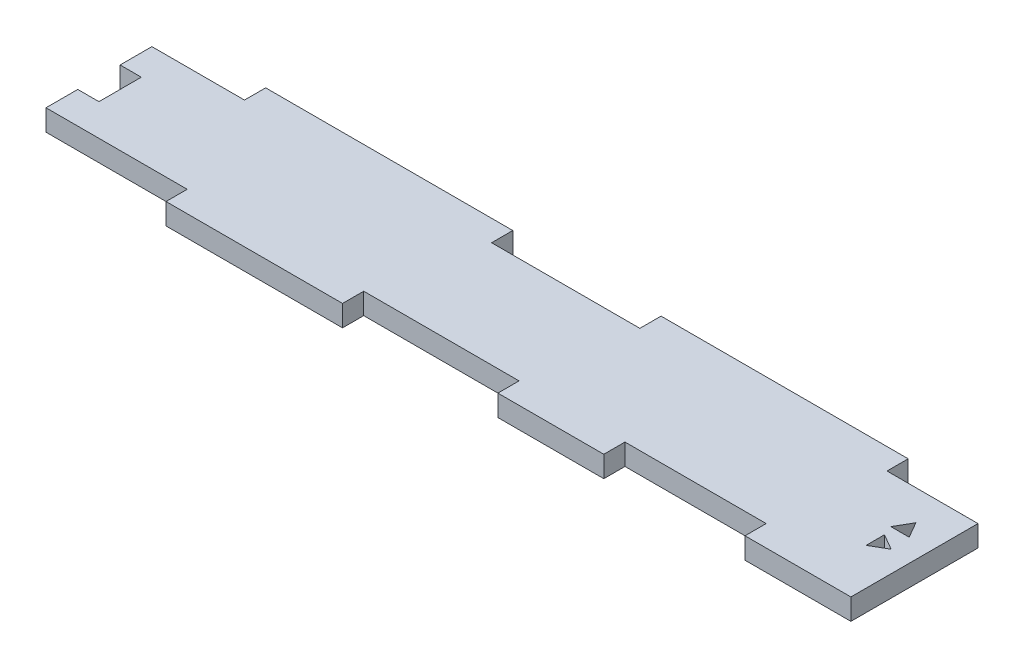
ISO-10303-21;
HEADER;
FILE_DESCRIPTION(('STEP AP214'),'2;1');
FILE_NAME('part.step','',(''),(''),'','','');
FILE_SCHEMA(('AUTOMOTIVE_DESIGN { 1 0 10303 214 1 1 1 1 }'));
ENDSEC;
DATA;
#1=APPLICATION_CONTEXT('core data for automotive mechanical design processes');
#2=APPLICATION_PROTOCOL_DEFINITION('international standard','automotive_design',2000,#1);
#3=PRODUCT_CONTEXT('',#1,'mechanical');
#4=PRODUCT('Part','Part','',(#3));
#5=PRODUCT_RELATED_PRODUCT_CATEGORY('part','',(#4));
#6=PRODUCT_DEFINITION_FORMATION('','',#4);
#7=PRODUCT_DEFINITION_CONTEXT('part definition',#1,'design');
#8=PRODUCT_DEFINITION('design','',#6,#7);
#9=PRODUCT_DEFINITION_SHAPE('','',#8);
#10=(LENGTH_UNIT() NAMED_UNIT(*) SI_UNIT(.MILLI.,.METRE.));
#11=(NAMED_UNIT(*) PLANE_ANGLE_UNIT() SI_UNIT($,.RADIAN.));
#12=(NAMED_UNIT(*) SI_UNIT($,.STERADIAN.) SOLID_ANGLE_UNIT());
#13=UNCERTAINTY_MEASURE_WITH_UNIT(LENGTH_MEASURE(1.E-05),#10,'distance_accuracy_value','');
#14=(GEOMETRIC_REPRESENTATION_CONTEXT(3) GLOBAL_UNCERTAINTY_ASSIGNED_CONTEXT((#13)) GLOBAL_UNIT_ASSIGNED_CONTEXT((#10,
#11,#12)) REPRESENTATION_CONTEXT('',''));
#15=CARTESIAN_POINT('',(0.,0.,0.));
#16=DIRECTION('',(0.,0.,1.));
#17=DIRECTION('',(1.,0.,0.));
#18=AXIS2_PLACEMENT_3D('',#15,#16,#17);
#19=CARTESIAN_POINT('',(-58.5,1.5,-7.5));
#20=DIRECTION('',(1.,0.,0.));
#21=DIRECTION('',(0.,0.,-1.));
#22=AXIS2_PLACEMENT_3D('',#19,#20,#21);
#23=PLANE('',#22);
#24=DIRECTION('',(0.,0.,1.));
#25=VECTOR('',#24,1.);
#26=CARTESIAN_POINT('',(-58.5,-1.5,-7.5));
#27=LINE('',#26,#25);
#28=CARTESIAN_POINT('',(-58.5,-1.5,-7.5));
#29=VERTEX_POINT('',#28);
#30=CARTESIAN_POINT('',(-58.5,-1.5,-3.));
#31=VERTEX_POINT('',#30);
#32=EDGE_CURVE('E308',#29,#31,#27,.T.);
#33=ORIENTED_EDGE('',*,*,#32,.T.);
#34=DIRECTION('',(0.,1.,0.));
#35=VECTOR('',#34,1.);
#36=CARTESIAN_POINT('',(-58.5,-1.5,-3.));
#37=LINE('',#36,#35);
#38=CARTESIAN_POINT('',(-58.5,1.5,-3.));
#39=VERTEX_POINT('',#38);
#40=EDGE_CURVE('E567',#31,#39,#37,.T.);
#41=ORIENTED_EDGE('',*,*,#40,.T.);
#42=DIRECTION('',(0.,0.,1.));
#43=VECTOR('',#42,1.);
#44=CARTESIAN_POINT('',(-58.5,1.5,-7.5));
#45=LINE('',#44,#43);
#46=CARTESIAN_POINT('',(-58.5,1.5,-7.5));
#47=VERTEX_POINT('',#46);
#48=EDGE_CURVE('E280',#47,#39,#45,.T.);
#49=ORIENTED_EDGE('',*,*,#48,.F.);
#50=DIRECTION('',(0.,-1.,0.));
#51=VECTOR('',#50,1.);
#52=CARTESIAN_POINT('',(-58.5,1.5,-7.5));
#53=LINE('',#52,#51);
#54=EDGE_CURVE('E306',#47,#29,#53,.T.);
#55=ORIENTED_EDGE('',*,*,#54,.T.);
#56=EDGE_LOOP('',(#33,#41,#49,#55));
#57=FACE_BOUND('',#56,.T.);
#58=ADVANCED_FACE('F43',(#57),#23,.F.);
#59=CARTESIAN_POINT('',(-58.5,1.5,-7.5));
#60=DIRECTION('',(0.,0.,1.));
#61=DIRECTION('',(1.,0.,0.));
#62=AXIS2_PLACEMENT_3D('',#59,#60,#61);
#63=PLANE('',#62);
#64=DIRECTION('',(0.,-1.,0.));
#65=VECTOR('',#64,1.);
#66=CARTESIAN_POINT('',(10.61,1.5,-7.49999999999999));
#67=LINE('',#66,#65);
#68=CARTESIAN_POINT('',(10.61,1.5,-7.5));
#69=VERTEX_POINT('',#68);
#70=CARTESIAN_POINT('',(10.61,-1.5,-7.49999999999999));
#71=VERTEX_POINT('',#70);
#72=EDGE_CURVE('E366',#69,#71,#67,.T.);
#73=ORIENTED_EDGE('',*,*,#72,.T.);
#74=DIRECTION('',(-1.,0.,0.));
#75=VECTOR('',#74,1.);
#76=CARTESIAN_POINT('',(-58.5,-1.5,-7.5));
#77=LINE('',#76,#75);
#78=CARTESIAN_POINT('',(-10.39,-1.5,-7.49999999999999));
#79=VERTEX_POINT('',#78);
#80=EDGE_CURVE('E287',#71,#79,#77,.T.);
#81=ORIENTED_EDGE('',*,*,#80,.T.);
#82=DIRECTION('',(0.,-1.,0.));
#83=VECTOR('',#82,1.);
#84=CARTESIAN_POINT('',(-10.39,1.5,-7.49999999999999));
#85=LINE('',#84,#83);
#86=CARTESIAN_POINT('',(-10.39,1.5,-7.49999999999999));
#87=VERTEX_POINT('',#86);
#88=EDGE_CURVE('E396',#87,#79,#85,.T.);
#89=ORIENTED_EDGE('',*,*,#88,.F.);
#90=DIRECTION('',(-1.,0.,0.));
#91=VECTOR('',#90,1.);
#92=CARTESIAN_POINT('',(-58.5,1.5,-7.5));
#93=LINE('',#92,#91);
#94=EDGE_CURVE('E307',#69,#87,#93,.T.);
#95=ORIENTED_EDGE('',*,*,#94,.F.);
#96=EDGE_LOOP('',(#73,#81,#89,#95));
#97=FACE_BOUND('',#96,.T.);
#98=ADVANCED_FACE('F554',(#97),#63,.F.);
#99=DIRECTION('',(0.,-1.,0.));
#100=VECTOR('',#99,1.);
#101=CARTESIAN_POINT('',(45.61,1.5,-7.49999999999999));
#102=LINE('',#101,#100);
#103=CARTESIAN_POINT('',(45.61,1.5,-7.49999999999999));
#104=VERTEX_POINT('',#103);
#105=CARTESIAN_POINT('',(45.61,-1.5,-7.49999999999999));
#106=VERTEX_POINT('',#105);
#107=EDGE_CURVE('E363',#104,#106,#102,.T.);
#108=ORIENTED_EDGE('',*,*,#107,.F.);
#109=CARTESIAN_POINT('',(58.5,1.5,-7.49999999999999));
#110=VERTEX_POINT('',#109);
#111=EDGE_CURVE('E302',#110,#104,#93,.T.);
#112=ORIENTED_EDGE('',*,*,#111,.F.);
#113=DIRECTION('',(0.,-1.,0.));
#114=VECTOR('',#113,1.);
#115=CARTESIAN_POINT('',(58.5,1.5,-7.49999999999999));
#116=LINE('',#115,#114);
#117=CARTESIAN_POINT('',(58.5,-1.5,-7.49999999999999));
#118=VERTEX_POINT('',#117);
#119=EDGE_CURVE('E52',#110,#118,#116,.T.);
#120=ORIENTED_EDGE('',*,*,#119,.T.);
#121=EDGE_CURVE('E281',#118,#106,#77,.T.);
#122=ORIENTED_EDGE('',*,*,#121,.T.);
#123=EDGE_LOOP('',(#108,#112,#120,#122));
#124=FACE_BOUND('',#123,.T.);
#125=ADVANCED_FACE('F329',(#124),#63,.F.);
#126=CARTESIAN_POINT('',(-58.5,1.5,7.5));
#127=DIRECTION('',(0.,0.,-1.));
#128=DIRECTION('',(-1.,0.,0.));
#129=AXIS2_PLACEMENT_3D('',#126,#127,#128);
#130=PLANE('',#129);
#131=DIRECTION('',(0.,-1.,0.));
#132=VECTOR('',#131,1.);
#133=CARTESIAN_POINT('',(-38.5,1.5,7.5));
#134=LINE('',#133,#132);
#135=CARTESIAN_POINT('',(-38.5,1.5,7.5));
#136=VERTEX_POINT('',#135);
#137=CARTESIAN_POINT('',(-38.5,-1.5,7.5));
#138=VERTEX_POINT('',#137);
#139=EDGE_CURVE('E417',#136,#138,#134,.T.);
#140=ORIENTED_EDGE('',*,*,#139,.F.);
#141=DIRECTION('',(1.,0.,0.));
#142=VECTOR('',#141,1.);
#143=CARTESIAN_POINT('',(-58.5,1.5,7.5));
#144=LINE('',#143,#142);
#145=CARTESIAN_POINT('',(-58.5,1.5,7.5));
#146=VERTEX_POINT('',#145);
#147=EDGE_CURVE('E294',#146,#136,#144,.T.);
#148=ORIENTED_EDGE('',*,*,#147,.F.);
#149=DIRECTION('',(0.,-1.,0.));
#150=VECTOR('',#149,1.);
#151=CARTESIAN_POINT('',(-58.5,1.5,7.5));
#152=LINE('',#151,#150);
#153=CARTESIAN_POINT('',(-58.5,-1.5,7.5));
#154=VERTEX_POINT('',#153);
#155=EDGE_CURVE('E11',#146,#154,#152,.T.);
#156=ORIENTED_EDGE('',*,*,#155,.T.);
#157=DIRECTION('',(1.,0.,0.));
#158=VECTOR('',#157,1.);
#159=CARTESIAN_POINT('',(-58.5,-1.5,7.5));
#160=LINE('',#159,#158);
#161=EDGE_CURVE('E314',#154,#138,#160,.T.);
#162=ORIENTED_EDGE('',*,*,#161,.T.);
#163=EDGE_LOOP('',(#140,#148,#156,#162));
#164=FACE_BOUND('',#163,.T.);
#165=ADVANCED_FACE('F511',(#164),#130,.F.);
#166=DIRECTION('',(0.,-1.,0.));
#167=VECTOR('',#166,1.);
#168=CARTESIAN_POINT('',(-13.5,1.5,7.5));
#169=LINE('',#168,#167);
#170=CARTESIAN_POINT('',(-13.5,1.5,7.5));
#171=VERTEX_POINT('',#170);
#172=CARTESIAN_POINT('',(-13.5,-1.5,7.5));
#173=VERTEX_POINT('',#172);
#174=EDGE_CURVE('E430',#171,#173,#169,.T.);
#175=ORIENTED_EDGE('',*,*,#174,.T.);
#176=CARTESIAN_POINT('',(8.5,-1.5,7.5));
#177=VERTEX_POINT('',#176);
#178=EDGE_CURVE('E318',#173,#177,#160,.T.);
#179=ORIENTED_EDGE('',*,*,#178,.T.);
#180=DIRECTION('',(0.,-1.,0.));
#181=VECTOR('',#180,1.);
#182=CARTESIAN_POINT('',(8.5,1.5,7.5));
#183=LINE('',#182,#181);
#184=CARTESIAN_POINT('',(8.5,1.5,7.5));
#185=VERTEX_POINT('',#184);
#186=EDGE_CURVE('E481',#185,#177,#183,.T.);
#187=ORIENTED_EDGE('',*,*,#186,.F.);
#188=EDGE_CURVE('E298',#171,#185,#144,.T.);
#189=ORIENTED_EDGE('',*,*,#188,.F.);
#190=EDGE_LOOP('',(#175,#179,#187,#189));
#191=FACE_BOUND('',#190,.T.);
#192=ADVANCED_FACE('F526',(#191),#130,.F.);
#193=DIRECTION('',(0.,-1.,0.));
#194=VECTOR('',#193,1.);
#195=CARTESIAN_POINT('',(43.5,1.5,7.5));
#196=LINE('',#195,#194);
#197=CARTESIAN_POINT('',(43.5,1.5,7.49999999999999));
#198=VERTEX_POINT('',#197);
#199=CARTESIAN_POINT('',(43.5,-1.5,7.49999999999999));
#200=VERTEX_POINT('',#199);
#201=EDGE_CURVE('E452',#198,#200,#196,.T.);
#202=ORIENTED_EDGE('',*,*,#201,.F.);
#203=CARTESIAN_POINT('',(23.5,1.5,7.5));
#204=VERTEX_POINT('',#203);
#205=EDGE_CURVE('E286',#204,#198,#144,.T.);
#206=ORIENTED_EDGE('',*,*,#205,.F.);
#207=DIRECTION('',(0.,-1.,0.));
#208=VECTOR('',#207,1.);
#209=CARTESIAN_POINT('',(23.5,1.5,7.5));
#210=LINE('',#209,#208);
#211=CARTESIAN_POINT('',(23.5,-1.5,7.49999999999999));
#212=VERTEX_POINT('',#211);
#213=EDGE_CURVE('E493',#204,#212,#210,.T.);
#214=ORIENTED_EDGE('',*,*,#213,.T.);
#215=EDGE_CURVE('E312',#212,#200,#160,.T.);
#216=ORIENTED_EDGE('',*,*,#215,.T.);
#217=EDGE_LOOP('',(#202,#206,#214,#216));
#218=FACE_BOUND('',#217,.T.);
#219=ADVANCED_FACE('F556',(#218),#130,.F.);
#220=CARTESIAN_POINT('',(-58.5,1.5,3.));
#221=VERTEX_POINT('',#220);
#222=EDGE_CURVE('E272',#221,#146,#45,.T.);
#223=ORIENTED_EDGE('',*,*,#222,.F.);
#224=DIRECTION('',(0.,1.,0.));
#225=VECTOR('',#224,1.);
#226=CARTESIAN_POINT('',(-58.5,-1.5,3.));
#227=LINE('',#226,#225);
#228=CARTESIAN_POINT('',(-58.5,-1.5,3.));
#229=VERTEX_POINT('',#228);
#230=EDGE_CURVE('E253',#229,#221,#227,.T.);
#231=ORIENTED_EDGE('',*,*,#230,.F.);
#232=EDGE_CURVE('E313',#229,#154,#27,.T.);
#233=ORIENTED_EDGE('',*,*,#232,.T.);
#234=ORIENTED_EDGE('',*,*,#155,.F.);
#235=EDGE_LOOP('',(#223,#231,#233,#234));
#236=FACE_BOUND('',#235,.T.);
#237=ADVANCED_FACE('F45',(#236),#23,.F.);
#238=CARTESIAN_POINT('',(58.5,1.5,-7.49999999999999));
#239=DIRECTION('',(-1.,0.,0.));
#240=DIRECTION('',(0.,0.,1.));
#241=AXIS2_PLACEMENT_3D('',#238,#239,#240);
#242=PLANE('',#241);
#243=DIRECTION('',(0.,0.,-1.));
#244=VECTOR('',#243,1.);
#245=CARTESIAN_POINT('',(58.5,-1.5,-7.49999999999999));
#246=LINE('',#245,#244);
#247=CARTESIAN_POINT('',(58.5,-1.5,10.5));
#248=VERTEX_POINT('',#247);
#249=EDGE_CURVE('E317',#248,#118,#246,.T.);
#250=ORIENTED_EDGE('',*,*,#249,.T.);
#251=ORIENTED_EDGE('',*,*,#119,.F.);
#252=DIRECTION('',(0.,0.,-1.));
#253=VECTOR('',#252,1.);
#254=CARTESIAN_POINT('',(58.5,1.5,-7.49999999999999));
#255=LINE('',#254,#253);
#256=CARTESIAN_POINT('',(58.5,1.5,10.5));
#257=VERTEX_POINT('',#256);
#258=EDGE_CURVE('E297',#257,#110,#255,.T.);
#259=ORIENTED_EDGE('',*,*,#258,.F.);
#260=DIRECTION('',(0.,-1.,0.));
#261=VECTOR('',#260,1.);
#262=CARTESIAN_POINT('',(58.5,1.5,10.5));
#263=LINE('',#262,#261);
#264=EDGE_CURVE('E461',#257,#248,#263,.T.);
#265=ORIENTED_EDGE('',*,*,#264,.T.);
#266=EDGE_LOOP('',(#250,#251,#259,#265));
#267=FACE_BOUND('',#266,.T.);
#268=ADVANCED_FACE('F543',(#267),#242,.F.);
#269=CARTESIAN_POINT('',(-45.39,1.5,-7.49999999999999));
#270=VERTEX_POINT('',#269);
#271=EDGE_CURVE('E301',#270,#47,#93,.T.);
#272=ORIENTED_EDGE('',*,*,#271,.F.);
#273=DIRECTION('',(0.,-1.,0.));
#274=VECTOR('',#273,1.);
#275=CARTESIAN_POINT('',(-45.39,1.5,-7.49999999999999));
#276=LINE('',#275,#274);
#277=CARTESIAN_POINT('',(-45.39,-1.5,-7.5));
#278=VERTEX_POINT('',#277);
#279=EDGE_CURVE('E400',#270,#278,#276,.T.);
#280=ORIENTED_EDGE('',*,*,#279,.T.);
#281=EDGE_CURVE('E289',#278,#29,#77,.T.);
#282=ORIENTED_EDGE('',*,*,#281,.T.);
#283=ORIENTED_EDGE('',*,*,#54,.F.);
#284=EDGE_LOOP('',(#272,#280,#282,#283));
#285=FACE_BOUND('',#284,.T.);
#286=ADVANCED_FACE('F545',(#285),#63,.F.);
#287=CARTESIAN_POINT('',(0.,1.5,0.));
#288=DIRECTION('',(0.,1.,0.));
#289=DIRECTION('',(0.,0.,1.));
#290=AXIS2_PLACEMENT_3D('',#287,#288,#289);
#291=PLANE('',#290);
#292=DIRECTION('',(-1.,0.,0.));
#293=VECTOR('',#292,1.);
#294=CARTESIAN_POINT('',(-58.5,1.5,-3.));
#295=LINE('',#294,#293);
#296=CARTESIAN_POINT('',(-55.5,1.5,-3.));
#297=VERTEX_POINT('',#296);
#298=EDGE_CURVE('E870',#297,#39,#295,.T.);
#299=ORIENTED_EDGE('',*,*,#298,.F.);
#300=DIRECTION('',(0.,0.,-1.));
#301=VECTOR('',#300,1.);
#302=CARTESIAN_POINT('',(-55.5,1.5,-3.));
#303=LINE('',#302,#301);
#304=CARTESIAN_POINT('',(-55.5,1.5,3.));
#305=VERTEX_POINT('',#304);
#306=EDGE_CURVE('E275',#305,#297,#303,.T.);
#307=ORIENTED_EDGE('',*,*,#306,.F.);
#308=DIRECTION('',(1.,0.,0.));
#309=VECTOR('',#308,1.);
#310=CARTESIAN_POINT('',(-58.5,1.5,3.));
#311=LINE('',#310,#309);
#312=EDGE_CURVE('E256',#221,#305,#311,.T.);
#313=ORIENTED_EDGE('',*,*,#312,.F.);
#314=ORIENTED_EDGE('',*,*,#222,.T.);
#315=ORIENTED_EDGE('',*,*,#147,.T.);
#316=DIRECTION('',(0.,0.,1.));
#317=VECTOR('',#316,1.);
#318=CARTESIAN_POINT('',(-38.5,1.5,7.5));
#319=LINE('',#318,#317);
#320=CARTESIAN_POINT('',(-38.5,1.5,10.5));
#321=VERTEX_POINT('',#320);
#322=EDGE_CURVE('E405',#136,#321,#319,.T.);
#323=ORIENTED_EDGE('',*,*,#322,.T.);
#324=DIRECTION('',(1.,0.,0.));
#325=VECTOR('',#324,1.);
#326=CARTESIAN_POINT('',(-38.5,1.5,10.5));
#327=LINE('',#326,#325);
#328=CARTESIAN_POINT('',(-13.5,1.5,10.5));
#329=VERTEX_POINT('',#328);
#330=EDGE_CURVE('E409',#321,#329,#327,.T.);
#331=ORIENTED_EDGE('',*,*,#330,.T.);
#332=DIRECTION('',(0.,0.,-1.));
#333=VECTOR('',#332,1.);
#334=CARTESIAN_POINT('',(-13.5,1.5,7.5));
#335=LINE('',#334,#333);
#336=EDGE_CURVE('E413',#329,#171,#335,.T.);
#337=ORIENTED_EDGE('',*,*,#336,.T.);
#338=ORIENTED_EDGE('',*,*,#188,.T.);
#339=DIRECTION('',(0.,0.,1.));
#340=VECTOR('',#339,1.);
#341=CARTESIAN_POINT('',(8.5,1.5,7.5));
#342=LINE('',#341,#340);
#343=CARTESIAN_POINT('',(8.5,1.5,10.5));
#344=VERTEX_POINT('',#343);
#345=EDGE_CURVE('E470',#185,#344,#342,.T.);
#346=ORIENTED_EDGE('',*,*,#345,.T.);
#347=DIRECTION('',(1.,0.,0.));
#348=VECTOR('',#347,1.);
#349=CARTESIAN_POINT('',(8.5,1.5,10.5));
#350=LINE('',#349,#348);
#351=CARTESIAN_POINT('',(23.5,1.5,10.5));
#352=VERTEX_POINT('',#351);
#353=EDGE_CURVE('E474',#344,#352,#350,.T.);
#354=ORIENTED_EDGE('',*,*,#353,.T.);
#355=DIRECTION('',(0.,0.,-1.));
#356=VECTOR('',#355,1.);
#357=CARTESIAN_POINT('',(23.5,1.5,7.5));
#358=LINE('',#357,#356);
#359=EDGE_CURVE('E478',#352,#204,#358,.T.);
#360=ORIENTED_EDGE('',*,*,#359,.T.);
#361=ORIENTED_EDGE('',*,*,#205,.T.);
#362=DIRECTION('',(0.,0.,1.));
#363=VECTOR('',#362,1.);
#364=CARTESIAN_POINT('',(43.5,1.5,7.5));
#365=LINE('',#364,#363);
#366=CARTESIAN_POINT('',(43.5,1.5,10.5));
#367=VERTEX_POINT('',#366);
#368=EDGE_CURVE('E443',#198,#367,#365,.T.);
#369=ORIENTED_EDGE('',*,*,#368,.T.);
#370=DIRECTION('',(1.,0.,0.));
#371=VECTOR('',#370,1.);
#372=CARTESIAN_POINT('',(43.5,1.5,10.5));
#373=LINE('',#372,#371);
#374=EDGE_CURVE('E447',#367,#257,#373,.T.);
#375=ORIENTED_EDGE('',*,*,#374,.T.);
#376=ORIENTED_EDGE('',*,*,#258,.T.);
#377=ORIENTED_EDGE('',*,*,#111,.T.);
#378=DIRECTION('',(0.,0.,-1.));
#379=VECTOR('',#378,1.);
#380=CARTESIAN_POINT('',(45.61,1.5,-10.5));
#381=LINE('',#380,#379);
#382=CARTESIAN_POINT('',(45.61,1.5,-10.5));
#383=VERTEX_POINT('',#382);
#384=EDGE_CURVE('E653',#104,#383,#381,.T.);
#385=ORIENTED_EDGE('',*,*,#384,.T.);
#386=DIRECTION('',(-1.,0.,0.));
#387=VECTOR('',#386,1.);
#388=CARTESIAN_POINT('',(10.61,1.5,-10.5));
#389=LINE('',#388,#387);
#390=CARTESIAN_POINT('',(10.61,1.5,-10.5));
#391=VERTEX_POINT('',#390);
#392=EDGE_CURVE('E360',#383,#391,#389,.T.);
#393=ORIENTED_EDGE('',*,*,#392,.T.);
#394=DIRECTION('',(0.,0.,1.));
#395=VECTOR('',#394,1.);
#396=CARTESIAN_POINT('',(10.61,1.5,-10.5));
#397=LINE('',#396,#395);
#398=EDGE_CURVE('E348',#391,#69,#397,.T.);
#399=ORIENTED_EDGE('',*,*,#398,.T.);
#400=ORIENTED_EDGE('',*,*,#94,.T.);
#401=DIRECTION('',(0.,0.,-1.));
#402=VECTOR('',#401,1.);
#403=CARTESIAN_POINT('',(-10.39,1.5,-7.49999999999999));
#404=LINE('',#403,#402);
#405=CARTESIAN_POINT('',(-10.39,1.5,-10.5));
#406=VERTEX_POINT('',#405);
#407=EDGE_CURVE('E374',#87,#406,#404,.T.);
#408=ORIENTED_EDGE('',*,*,#407,.T.);
#409=DIRECTION('',(-1.,0.,0.));
#410=VECTOR('',#409,1.);
#411=CARTESIAN_POINT('',(-45.39,1.5,-10.5));
#412=LINE('',#411,#410);
#413=CARTESIAN_POINT('',(-45.39,1.5,-10.5));
#414=VERTEX_POINT('',#413);
#415=EDGE_CURVE('E378',#406,#414,#412,.T.);
#416=ORIENTED_EDGE('',*,*,#415,.T.);
#417=DIRECTION('',(0.,0.,1.));
#418=VECTOR('',#417,1.);
#419=CARTESIAN_POINT('',(-45.39,1.5,-7.49999999999999));
#420=LINE('',#419,#418);
#421=EDGE_CURVE('E371',#414,#270,#420,.T.);
#422=ORIENTED_EDGE('',*,*,#421,.T.);
#423=ORIENTED_EDGE('',*,*,#271,.T.);
#424=ORIENTED_EDGE('',*,*,#48,.T.);
#425=EDGE_LOOP('',(#299,#307,#313,#314,#315,#323,#331,#337,#338,#346,#354,#360,#361,#369,#375,
#376,#377,#385,#393,#399,#400,#408,#416,#422,#423,#424));
#426=FACE_BOUND('',#425,.T.);
#427=DIRECTION('',(0.866025403784438,0.,-0.500000000000001));
#428=VECTOR('',#427,1.);
#429=CARTESIAN_POINT('',(53.25,1.5,3.09807621135332));
#430=LINE('',#429,#428);
#431=CARTESIAN_POINT('',(53.25,1.5,3.09807621135332));
#432=VERTEX_POINT('',#431);
#433=CARTESIAN_POINT('',(55.5,1.5,1.79903810567665));
#434=VERTEX_POINT('',#433);
#435=EDGE_CURVE('E67',#432,#434,#430,.T.);
#436=ORIENTED_EDGE('',*,*,#435,.F.);
#437=DIRECTION('',(0.,0.,1.));
#438=VECTOR('',#437,1.);
#439=CARTESIAN_POINT('',(53.25,1.5,0.5));
#440=LINE('',#439,#438);
#441=CARTESIAN_POINT('',(53.25,1.5,0.5));
#442=VERTEX_POINT('',#441);
#443=EDGE_CURVE('E595',#442,#432,#440,.T.);
#444=ORIENTED_EDGE('',*,*,#443,.F.);
#445=DIRECTION('',(-0.866025403784441,0.,-0.499999999999997));
#446=VECTOR('',#445,1.);
#447=CARTESIAN_POINT('',(55.5,1.5,1.79903810567665));
#448=LINE('',#447,#446);
#449=EDGE_CURVE('E590',#434,#442,#448,.T.);
#450=ORIENTED_EDGE('',*,*,#449,.F.);
#451=EDGE_LOOP('',(#436,#444,#450));
#452=FACE_BOUND('',#451,.T.);
#453=DIRECTION('',(-0.5,0.,-0.866025403784438));
#454=VECTOR('',#453,1.);
#455=CARTESIAN_POINT('',(55.2990381056767,1.5,-0.952955395936156));
#456=LINE('',#455,#454);
#457=CARTESIAN_POINT('',(55.2990381056767,1.5,-0.952955395936156));
#458=VERTEX_POINT('',#457);
#459=CARTESIAN_POINT('',(54.,1.5,-3.20295539593614));
#460=VERTEX_POINT('',#459);
#461=EDGE_CURVE('E582',#458,#460,#456,.T.);
#462=ORIENTED_EDGE('',*,*,#461,.F.);
#463=DIRECTION('',(1.,0.,0.));
#464=VECTOR('',#463,1.);
#465=CARTESIAN_POINT('',(52.7009618943233,1.5,-0.952955395936156));
#466=LINE('',#465,#464);
#467=CARTESIAN_POINT('',(52.7009618943233,1.5,-0.952955395936156));
#468=VERTEX_POINT('',#467);
#469=EDGE_CURVE('E625',#468,#458,#466,.T.);
#470=ORIENTED_EDGE('',*,*,#469,.F.);
#471=DIRECTION('',(-0.5,0.,0.866025403784438));
#472=VECTOR('',#471,1.);
#473=CARTESIAN_POINT('',(54.,1.5,-3.20295539593614));
#474=LINE('',#473,#472);
#475=EDGE_CURVE('E621',#460,#468,#474,.T.);
#476=ORIENTED_EDGE('',*,*,#475,.F.);
#477=EDGE_LOOP('',(#462,#470,#476));
#478=FACE_BOUND('',#477,.T.);
#479=ADVANCED_FACE('F269',(#426,#452,#478),#291,.T.);
#480=CARTESIAN_POINT('',(0.,-1.5,0.));
#481=DIRECTION('',(0.,1.,0.));
#482=DIRECTION('',(0.,0.,1.));
#483=AXIS2_PLACEMENT_3D('',#480,#481,#482);
#484=PLANE('',#483);
#485=DIRECTION('',(0.,0.,1.));
#486=VECTOR('',#485,1.);
#487=CARTESIAN_POINT('',(53.25,-1.5,0.5));
#488=LINE('',#487,#486);
#489=CARTESIAN_POINT('',(53.25,-1.5,0.499999999999997));
#490=VERTEX_POINT('',#489);
#491=CARTESIAN_POINT('',(53.25,-1.5,3.09807621135332));
#492=VERTEX_POINT('',#491);
#493=EDGE_CURVE('E607',#490,#492,#488,.T.);
#494=ORIENTED_EDGE('',*,*,#493,.T.);
#495=DIRECTION('',(0.866025403784438,0.,-0.500000000000001));
#496=VECTOR('',#495,1.);
#497=CARTESIAN_POINT('',(53.25,-1.5,3.09807621135332));
#498=LINE('',#497,#496);
#499=CARTESIAN_POINT('',(55.5,-1.5,1.79903810567665));
#500=VERTEX_POINT('',#499);
#501=EDGE_CURVE('E599',#492,#500,#498,.T.);
#502=ORIENTED_EDGE('',*,*,#501,.T.);
#503=DIRECTION('',(-0.866025403784441,0.,-0.499999999999997));
#504=VECTOR('',#503,1.);
#505=CARTESIAN_POINT('',(55.5,-1.5,1.79903810567665));
#506=LINE('',#505,#504);
#507=EDGE_CURVE('E603',#500,#490,#506,.T.);
#508=ORIENTED_EDGE('',*,*,#507,.T.);
#509=EDGE_LOOP('',(#494,#502,#508));
#510=FACE_BOUND('',#509,.T.);
#511=DIRECTION('',(1.,0.,0.));
#512=VECTOR('',#511,1.);
#513=CARTESIAN_POINT('',(52.7009618943233,-1.5,-0.952955395936156));
#514=LINE('',#513,#512);
#515=CARTESIAN_POINT('',(52.7009618943234,-1.5,-0.952955395936157));
#516=VERTEX_POINT('',#515);
#517=CARTESIAN_POINT('',(55.2990381056767,-1.5,-0.952955395936156));
#518=VERTEX_POINT('',#517);
#519=EDGE_CURVE('E637',#516,#518,#514,.T.);
#520=ORIENTED_EDGE('',*,*,#519,.T.);
#521=DIRECTION('',(-0.5,0.,-0.866025403784438));
#522=VECTOR('',#521,1.);
#523=CARTESIAN_POINT('',(55.2990381056767,-1.5,-0.952955395936156));
#524=LINE('',#523,#522);
#525=CARTESIAN_POINT('',(54.,-1.5,-3.20295539593614));
#526=VERTEX_POINT('',#525);
#527=EDGE_CURVE('E629',#518,#526,#524,.T.);
#528=ORIENTED_EDGE('',*,*,#527,.T.);
#529=DIRECTION('',(-0.5,0.,0.866025403784438));
#530=VECTOR('',#529,1.);
#531=CARTESIAN_POINT('',(54.,-1.5,-3.20295539593614));
#532=LINE('',#531,#530);
#533=EDGE_CURVE('E633',#526,#516,#532,.T.);
#534=ORIENTED_EDGE('',*,*,#533,.T.);
#535=EDGE_LOOP('',(#520,#528,#534));
#536=FACE_BOUND('',#535,.T.);
#537=DIRECTION('',(0.,0.,-1.));
#538=VECTOR('',#537,1.);
#539=CARTESIAN_POINT('',(-55.5,-1.5,-3.));
#540=LINE('',#539,#538);
#541=CARTESIAN_POINT('',(-55.5,-1.5,3.));
#542=VERTEX_POINT('',#541);
#543=CARTESIAN_POINT('',(-55.5,-1.5,-3.));
#544=VERTEX_POINT('',#543);
#545=EDGE_CURVE('E59',#542,#544,#540,.T.);
#546=ORIENTED_EDGE('',*,*,#545,.T.);
#547=DIRECTION('',(-1.,0.,0.));
#548=VECTOR('',#547,1.);
#549=CARTESIAN_POINT('',(-58.5,-1.5,-3.));
#550=LINE('',#549,#548);
#551=EDGE_CURVE('E265',#544,#31,#550,.T.);
#552=ORIENTED_EDGE('',*,*,#551,.T.);
#553=ORIENTED_EDGE('',*,*,#32,.F.);
#554=ORIENTED_EDGE('',*,*,#281,.F.);
#555=DIRECTION('',(0.,0.,1.));
#556=VECTOR('',#555,1.);
#557=CARTESIAN_POINT('',(-45.39,-1.5,-7.49999999999999));
#558=LINE('',#557,#556);
#559=CARTESIAN_POINT('',(-45.39,-1.5,-10.5));
#560=VERTEX_POINT('',#559);
#561=EDGE_CURVE('E370',#560,#278,#558,.T.);
#562=ORIENTED_EDGE('',*,*,#561,.F.);
#563=DIRECTION('',(-1.,0.,0.));
#564=VECTOR('',#563,1.);
#565=CARTESIAN_POINT('',(-45.39,-1.5,-10.5));
#566=LINE('',#565,#564);
#567=CARTESIAN_POINT('',(-10.39,-1.5,-10.5));
#568=VERTEX_POINT('',#567);
#569=EDGE_CURVE('E375',#568,#560,#566,.T.);
#570=ORIENTED_EDGE('',*,*,#569,.F.);
#571=DIRECTION('',(0.,0.,-1.));
#572=VECTOR('',#571,1.);
#573=CARTESIAN_POINT('',(-10.39,-1.5,-7.49999999999999));
#574=LINE('',#573,#572);
#575=EDGE_CURVE('E384',#79,#568,#574,.T.);
#576=ORIENTED_EDGE('',*,*,#575,.F.);
#577=ORIENTED_EDGE('',*,*,#80,.F.);
#578=DIRECTION('',(0.,0.,1.));
#579=VECTOR('',#578,1.);
#580=CARTESIAN_POINT('',(10.61,-1.5,-10.5));
#581=LINE('',#580,#579);
#582=CARTESIAN_POINT('',(10.61,-1.5,-10.5));
#583=VERTEX_POINT('',#582);
#584=EDGE_CURVE('E344',#583,#71,#581,.T.);
#585=ORIENTED_EDGE('',*,*,#584,.F.);
#586=DIRECTION('',(-1.,0.,0.));
#587=VECTOR('',#586,1.);
#588=CARTESIAN_POINT('',(10.61,-1.5,-10.5));
#589=LINE('',#588,#587);
#590=CARTESIAN_POINT('',(45.61,-1.5,-10.5));
#591=VERTEX_POINT('',#590);
#592=EDGE_CURVE('E339',#591,#583,#589,.T.);
#593=ORIENTED_EDGE('',*,*,#592,.F.);
#594=DIRECTION('',(0.,0.,-1.));
#595=VECTOR('',#594,1.);
#596=CARTESIAN_POINT('',(45.61,-1.5,-10.5));
#597=LINE('',#596,#595);
#598=EDGE_CURVE('E337',#106,#591,#597,.T.);
#599=ORIENTED_EDGE('',*,*,#598,.F.);
#600=ORIENTED_EDGE('',*,*,#121,.F.);
#601=ORIENTED_EDGE('',*,*,#249,.F.);
#602=DIRECTION('',(1.,0.,0.));
#603=VECTOR('',#602,1.);
#604=CARTESIAN_POINT('',(43.5,-1.5,10.5));
#605=LINE('',#604,#603);
#606=CARTESIAN_POINT('',(43.5,-1.5,10.5));
#607=VERTEX_POINT('',#606);
#608=EDGE_CURVE('E448',#607,#248,#605,.T.);
#609=ORIENTED_EDGE('',*,*,#608,.F.);
#610=DIRECTION('',(0.,0.,1.));
#611=VECTOR('',#610,1.);
#612=CARTESIAN_POINT('',(43.5,-1.5,7.5));
#613=LINE('',#612,#611);
#614=EDGE_CURVE('E442',#200,#607,#613,.T.);
#615=ORIENTED_EDGE('',*,*,#614,.F.);
#616=ORIENTED_EDGE('',*,*,#215,.F.);
#617=DIRECTION('',(0.,0.,-1.));
#618=VECTOR('',#617,1.);
#619=CARTESIAN_POINT('',(23.5,-1.5,7.5));
#620=LINE('',#619,#618);
#621=CARTESIAN_POINT('',(23.5,-1.5,10.5));
#622=VERTEX_POINT('',#621);
#623=EDGE_CURVE('E475',#622,#212,#620,.T.);
#624=ORIENTED_EDGE('',*,*,#623,.F.);
#625=DIRECTION('',(1.,0.,0.));
#626=VECTOR('',#625,1.);
#627=CARTESIAN_POINT('',(8.5,-1.5,10.5));
#628=LINE('',#627,#626);
#629=CARTESIAN_POINT('',(8.5,-1.5,10.5));
#630=VERTEX_POINT('',#629);
#631=EDGE_CURVE('E485',#630,#622,#628,.T.);
#632=ORIENTED_EDGE('',*,*,#631,.F.);
#633=DIRECTION('',(0.,0.,1.));
#634=VECTOR('',#633,1.);
#635=CARTESIAN_POINT('',(8.5,-1.5,7.5));
#636=LINE('',#635,#634);
#637=EDGE_CURVE('E469',#177,#630,#636,.T.);
#638=ORIENTED_EDGE('',*,*,#637,.F.);
#639=ORIENTED_EDGE('',*,*,#178,.F.);
#640=DIRECTION('',(0.,0.,-1.));
#641=VECTOR('',#640,1.);
#642=CARTESIAN_POINT('',(-13.5,-1.5,7.5));
#643=LINE('',#642,#641);
#644=CARTESIAN_POINT('',(-13.5,-1.5,10.5));
#645=VERTEX_POINT('',#644);
#646=EDGE_CURVE('E410',#645,#173,#643,.T.);
#647=ORIENTED_EDGE('',*,*,#646,.F.);
#648=DIRECTION('',(1.,0.,0.));
#649=VECTOR('',#648,1.);
#650=CARTESIAN_POINT('',(-38.5,-1.5,10.5));
#651=LINE('',#650,#649);
#652=CARTESIAN_POINT('',(-38.5,-1.5,10.5));
#653=VERTEX_POINT('',#652);
#654=EDGE_CURVE('E421',#653,#645,#651,.T.);
#655=ORIENTED_EDGE('',*,*,#654,.F.);
#656=DIRECTION('',(0.,0.,1.));
#657=VECTOR('',#656,1.);
#658=CARTESIAN_POINT('',(-38.5,-1.5,7.5));
#659=LINE('',#658,#657);
#660=EDGE_CURVE('E404',#138,#653,#659,.T.);
#661=ORIENTED_EDGE('',*,*,#660,.F.);
#662=ORIENTED_EDGE('',*,*,#161,.F.);
#663=ORIENTED_EDGE('',*,*,#232,.F.);
#664=DIRECTION('',(1.,0.,0.));
#665=VECTOR('',#664,1.);
#666=CARTESIAN_POINT('',(-58.5,-1.5,3.));
#667=LINE('',#666,#665);
#668=EDGE_CURVE('E259',#229,#542,#667,.T.);
#669=ORIENTED_EDGE('',*,*,#668,.T.);
#670=EDGE_LOOP('',(#546,#552,#553,#554,#562,#570,#576,#577,#585,#593,#599,#600,#601,#609,#615,
#616,#624,#632,#638,#639,#647,#655,#661,#662,#663,#669));
#671=FACE_BOUND('',#670,.T.);
#672=ADVANCED_FACE('F334',(#510,#536,#671),#484,.F.);
#673=CARTESIAN_POINT('',(8.5,1.5,7.5));
#674=DIRECTION('',(1.,0.,0.));
#675=DIRECTION('',(0.,0.,-1.));
#676=AXIS2_PLACEMENT_3D('',#673,#674,#675);
#677=PLANE('',#676);
#678=ORIENTED_EDGE('',*,*,#637,.T.);
#679=DIRECTION('',(0.,-1.,0.));
#680=VECTOR('',#679,1.);
#681=CARTESIAN_POINT('',(8.5,1.5,10.5));
#682=LINE('',#681,#680);
#683=EDGE_CURVE('E292',#344,#630,#682,.T.);
#684=ORIENTED_EDGE('',*,*,#683,.F.);
#685=ORIENTED_EDGE('',*,*,#345,.F.);
#686=ORIENTED_EDGE('',*,*,#186,.T.);
#687=EDGE_LOOP('',(#678,#684,#685,#686));
#688=FACE_BOUND('',#687,.T.);
#689=ADVANCED_FACE('F686',(#688),#677,.F.);
#690=CARTESIAN_POINT('',(8.5,1.5,10.5));
#691=DIRECTION('',(0.,0.,-1.));
#692=DIRECTION('',(-1.,0.,0.));
#693=AXIS2_PLACEMENT_3D('',#690,#691,#692);
#694=PLANE('',#693);
#695=ORIENTED_EDGE('',*,*,#631,.T.);
#696=DIRECTION('',(0.,-1.,0.));
#697=VECTOR('',#696,1.);
#698=CARTESIAN_POINT('',(23.5,1.5,10.5));
#699=LINE('',#698,#697);
#700=EDGE_CURVE('E496',#352,#622,#699,.T.);
#701=ORIENTED_EDGE('',*,*,#700,.F.);
#702=ORIENTED_EDGE('',*,*,#353,.F.);
#703=ORIENTED_EDGE('',*,*,#683,.T.);
#704=EDGE_LOOP('',(#695,#701,#702,#703));
#705=FACE_BOUND('',#704,.T.);
#706=ADVANCED_FACE('F679',(#705),#694,.F.);
#707=CARTESIAN_POINT('',(23.5,1.5,7.5));
#708=DIRECTION('',(-1.,0.,0.));
#709=DIRECTION('',(0.,0.,1.));
#710=AXIS2_PLACEMENT_3D('',#707,#708,#709);
#711=PLANE('',#710);
#712=ORIENTED_EDGE('',*,*,#623,.T.);
#713=ORIENTED_EDGE('',*,*,#213,.F.);
#714=ORIENTED_EDGE('',*,*,#359,.F.);
#715=ORIENTED_EDGE('',*,*,#700,.T.);
#716=EDGE_LOOP('',(#712,#713,#714,#715));
#717=FACE_BOUND('',#716,.T.);
#718=ADVANCED_FACE('F677',(#717),#711,.F.);
#719=CARTESIAN_POINT('',(43.5,1.5,7.5));
#720=DIRECTION('',(1.,0.,0.));
#721=DIRECTION('',(0.,0.,-1.));
#722=AXIS2_PLACEMENT_3D('',#719,#720,#721);
#723=PLANE('',#722);
#724=ORIENTED_EDGE('',*,*,#614,.T.);
#725=DIRECTION('',(0.,-1.,0.));
#726=VECTOR('',#725,1.);
#727=CARTESIAN_POINT('',(43.5,1.5,10.5));
#728=LINE('',#727,#726);
#729=EDGE_CURVE('E465',#367,#607,#728,.T.);
#730=ORIENTED_EDGE('',*,*,#729,.F.);
#731=ORIENTED_EDGE('',*,*,#368,.F.);
#732=ORIENTED_EDGE('',*,*,#201,.T.);
#733=EDGE_LOOP('',(#724,#730,#731,#732));
#734=FACE_BOUND('',#733,.T.);
#735=ADVANCED_FACE('F537',(#734),#723,.F.);
#736=CARTESIAN_POINT('',(43.5,1.5,10.5));
#737=DIRECTION('',(0.,0.,-1.));
#738=DIRECTION('',(-1.,0.,0.));
#739=AXIS2_PLACEMENT_3D('',#736,#737,#738);
#740=PLANE('',#739);
#741=ORIENTED_EDGE('',*,*,#608,.T.);
#742=ORIENTED_EDGE('',*,*,#264,.F.);
#743=ORIENTED_EDGE('',*,*,#374,.F.);
#744=ORIENTED_EDGE('',*,*,#729,.T.);
#745=EDGE_LOOP('',(#741,#742,#743,#744));
#746=FACE_BOUND('',#745,.T.);
#747=ADVANCED_FACE('F540',(#746),#740,.F.);
#748=CARTESIAN_POINT('',(-38.5,1.5,7.5));
#749=DIRECTION('',(1.,0.,0.));
#750=DIRECTION('',(0.,0.,-1.));
#751=AXIS2_PLACEMENT_3D('',#748,#749,#750);
#752=PLANE('',#751);
#753=ORIENTED_EDGE('',*,*,#660,.T.);
#754=DIRECTION('',(0.,-1.,0.));
#755=VECTOR('',#754,1.);
#756=CARTESIAN_POINT('',(-38.5,1.5,10.5));
#757=LINE('',#756,#755);
#758=EDGE_CURVE('E438',#321,#653,#757,.T.);
#759=ORIENTED_EDGE('',*,*,#758,.F.);
#760=ORIENTED_EDGE('',*,*,#322,.F.);
#761=ORIENTED_EDGE('',*,*,#139,.T.);
#762=EDGE_LOOP('',(#753,#759,#760,#761));
#763=FACE_BOUND('',#762,.T.);
#764=ADVANCED_FACE('F515',(#763),#752,.F.);
#765=CARTESIAN_POINT('',(-38.5,1.5,10.5));
#766=DIRECTION('',(0.,0.,-1.));
#767=DIRECTION('',(-1.,0.,0.));
#768=AXIS2_PLACEMENT_3D('',#765,#766,#767);
#769=PLANE('',#768);
#770=ORIENTED_EDGE('',*,*,#654,.T.);
#771=DIRECTION('',(0.,-1.,0.));
#772=VECTOR('',#771,1.);
#773=CARTESIAN_POINT('',(-13.5,1.5,10.5));
#774=LINE('',#773,#772);
#775=EDGE_CURVE('E434',#329,#645,#774,.T.);
#776=ORIENTED_EDGE('',*,*,#775,.F.);
#777=ORIENTED_EDGE('',*,*,#330,.F.);
#778=ORIENTED_EDGE('',*,*,#758,.T.);
#779=EDGE_LOOP('',(#770,#776,#777,#778));
#780=FACE_BOUND('',#779,.T.);
#781=ADVANCED_FACE('F517',(#780),#769,.F.);
#782=CARTESIAN_POINT('',(-13.5,1.5,7.5));
#783=DIRECTION('',(-1.,0.,0.));
#784=DIRECTION('',(0.,0.,1.));
#785=AXIS2_PLACEMENT_3D('',#782,#783,#784);
#786=PLANE('',#785);
#787=ORIENTED_EDGE('',*,*,#646,.T.);
#788=ORIENTED_EDGE('',*,*,#174,.F.);
#789=ORIENTED_EDGE('',*,*,#336,.F.);
#790=ORIENTED_EDGE('',*,*,#775,.T.);
#791=EDGE_LOOP('',(#787,#788,#789,#790));
#792=FACE_BOUND('',#791,.T.);
#793=ADVANCED_FACE('F523',(#792),#786,.F.);
#794=CARTESIAN_POINT('',(-45.39,1.5,-7.49999999999999));
#795=DIRECTION('',(1.,0.,0.));
#796=DIRECTION('',(0.,0.,-1.));
#797=AXIS2_PLACEMENT_3D('',#794,#795,#796);
#798=PLANE('',#797);
#799=ORIENTED_EDGE('',*,*,#561,.T.);
#800=ORIENTED_EDGE('',*,*,#279,.F.);
#801=ORIENTED_EDGE('',*,*,#421,.F.);
#802=DIRECTION('',(0.,-1.,0.));
#803=VECTOR('',#802,1.);
#804=CARTESIAN_POINT('',(-45.39,1.5,-10.5));
#805=LINE('',#804,#803);
#806=EDGE_CURVE('E381',#414,#560,#805,.T.);
#807=ORIENTED_EDGE('',*,*,#806,.T.);
#808=EDGE_LOOP('',(#799,#800,#801,#807));
#809=FACE_BOUND('',#808,.T.);
#810=ADVANCED_FACE('F735',(#809),#798,.F.);
#811=CARTESIAN_POINT('',(-10.39,1.5,-7.49999999999999));
#812=DIRECTION('',(-1.,0.,0.));
#813=DIRECTION('',(0.,0.,1.));
#814=AXIS2_PLACEMENT_3D('',#811,#812,#813);
#815=PLANE('',#814);
#816=ORIENTED_EDGE('',*,*,#575,.T.);
#817=DIRECTION('',(0.,-1.,0.));
#818=VECTOR('',#817,1.);
#819=CARTESIAN_POINT('',(-10.39,1.5,-10.5));
#820=LINE('',#819,#818);
#821=EDGE_CURVE('E392',#406,#568,#820,.T.);
#822=ORIENTED_EDGE('',*,*,#821,.F.);
#823=ORIENTED_EDGE('',*,*,#407,.F.);
#824=ORIENTED_EDGE('',*,*,#88,.T.);
#825=EDGE_LOOP('',(#816,#822,#823,#824));
#826=FACE_BOUND('',#825,.T.);
#827=ADVANCED_FACE('F731',(#826),#815,.F.);
#828=CARTESIAN_POINT('',(-45.39,1.5,-10.5));
#829=DIRECTION('',(0.,0.,1.));
#830=DIRECTION('',(1.,0.,0.));
#831=AXIS2_PLACEMENT_3D('',#828,#829,#830);
#832=PLANE('',#831);
#833=ORIENTED_EDGE('',*,*,#569,.T.);
#834=ORIENTED_EDGE('',*,*,#806,.F.);
#835=ORIENTED_EDGE('',*,*,#415,.F.);
#836=ORIENTED_EDGE('',*,*,#821,.T.);
#837=EDGE_LOOP('',(#833,#834,#835,#836));
#838=FACE_BOUND('',#837,.T.);
#839=ADVANCED_FACE('F728',(#838),#832,.F.);
#840=CARTESIAN_POINT('',(10.61,1.5,-10.5));
#841=DIRECTION('',(1.,0.,0.));
#842=DIRECTION('',(0.,0.,-1.));
#843=AXIS2_PLACEMENT_3D('',#840,#841,#842);
#844=PLANE('',#843);
#845=ORIENTED_EDGE('',*,*,#584,.T.);
#846=ORIENTED_EDGE('',*,*,#72,.F.);
#847=ORIENTED_EDGE('',*,*,#398,.F.);
#848=DIRECTION('',(0.,-1.,0.));
#849=VECTOR('',#848,1.);
#850=CARTESIAN_POINT('',(10.61,1.5,-10.5));
#851=LINE('',#850,#849);
#852=EDGE_CURVE('E355',#391,#583,#851,.T.);
#853=ORIENTED_EDGE('',*,*,#852,.T.);
#854=EDGE_LOOP('',(#845,#846,#847,#853));
#855=FACE_BOUND('',#854,.T.);
#856=ADVANCED_FACE('F663',(#855),#844,.F.);
#857=CARTESIAN_POINT('',(45.61,1.5,-10.5));
#858=DIRECTION('',(-1.,0.,0.));
#859=DIRECTION('',(0.,0.,1.));
#860=AXIS2_PLACEMENT_3D('',#857,#858,#859);
#861=PLANE('',#860);
#862=ORIENTED_EDGE('',*,*,#598,.T.);
#863=DIRECTION('',(0.,-1.,0.));
#864=VECTOR('',#863,1.);
#865=CARTESIAN_POINT('',(45.61,1.5,-10.5));
#866=LINE('',#865,#864);
#867=EDGE_CURVE('E359',#383,#591,#866,.T.);
#868=ORIENTED_EDGE('',*,*,#867,.F.);
#869=ORIENTED_EDGE('',*,*,#384,.F.);
#870=ORIENTED_EDGE('',*,*,#107,.T.);
#871=EDGE_LOOP('',(#862,#868,#869,#870));
#872=FACE_BOUND('',#871,.T.);
#873=ADVANCED_FACE('F720',(#872),#861,.F.);
#874=CARTESIAN_POINT('',(10.61,1.5,-10.5));
#875=DIRECTION('',(0.,0.,1.));
#876=DIRECTION('',(1.,0.,0.));
#877=AXIS2_PLACEMENT_3D('',#874,#875,#876);
#878=PLANE('',#877);
#879=ORIENTED_EDGE('',*,*,#592,.T.);
#880=ORIENTED_EDGE('',*,*,#852,.F.);
#881=ORIENTED_EDGE('',*,*,#392,.F.);
#882=ORIENTED_EDGE('',*,*,#867,.T.);
#883=EDGE_LOOP('',(#879,#880,#881,#882));
#884=FACE_BOUND('',#883,.T.);
#885=ADVANCED_FACE('F661',(#884),#878,.F.);
#886=CARTESIAN_POINT('',(55.2990381056767,-1.5,-0.952955395936156));
#887=DIRECTION('',(0.866025403784438,0.,-0.500000000000001));
#888=DIRECTION('',(-0.500000000000001,0.,-0.866025403784438));
#889=AXIS2_PLACEMENT_3D('',#886,#887,#888);
#890=PLANE('',#889);
#891=DIRECTION('',(0.,1.,0.));
#892=VECTOR('',#891,1.);
#893=CARTESIAN_POINT('',(54.,-1.5,-3.20295539593614));
#894=LINE('',#893,#892);
#895=EDGE_CURVE('E641',#526,#460,#894,.T.);
#896=ORIENTED_EDGE('',*,*,#895,.F.);
#897=ORIENTED_EDGE('',*,*,#527,.F.);
#898=DIRECTION('',(0.,1.,0.));
#899=VECTOR('',#898,1.);
#900=CARTESIAN_POINT('',(55.2990381056767,-1.5,-0.952955395936156));
#901=LINE('',#900,#899);
#902=EDGE_CURVE('E591',#518,#458,#901,.T.);
#903=ORIENTED_EDGE('',*,*,#902,.T.);
#904=ORIENTED_EDGE('',*,*,#461,.T.);
#905=EDGE_LOOP('',(#896,#897,#903,#904));
#906=FACE_BOUND('',#905,.T.);
#907=ADVANCED_FACE('F712',(#906),#890,.F.);
#908=CARTESIAN_POINT('',(52.7009618943233,-1.5,-0.952955395936156));
#909=DIRECTION('',(0.,0.,1.));
#910=DIRECTION('',(1.,0.,0.));
#911=AXIS2_PLACEMENT_3D('',#908,#909,#910);
#912=PLANE('',#911);
#913=ORIENTED_EDGE('',*,*,#902,.F.);
#914=ORIENTED_EDGE('',*,*,#519,.F.);
#915=DIRECTION('',(0.,1.,0.));
#916=VECTOR('',#915,1.);
#917=CARTESIAN_POINT('',(52.7009618943233,-1.5,-0.952955395936156));
#918=LINE('',#917,#916);
#919=EDGE_CURVE('E644',#516,#468,#918,.T.);
#920=ORIENTED_EDGE('',*,*,#919,.T.);
#921=ORIENTED_EDGE('',*,*,#469,.T.);
#922=EDGE_LOOP('',(#913,#914,#920,#921));
#923=FACE_BOUND('',#922,.T.);
#924=ADVANCED_FACE('F704',(#923),#912,.F.);
#925=CARTESIAN_POINT('',(54.,-1.5,-3.20295539593614));
#926=DIRECTION('',(-0.866025403784438,0.,-0.500000000000001));
#927=DIRECTION('',(-0.500000000000001,0.,0.866025403784438));
#928=AXIS2_PLACEMENT_3D('',#925,#926,#927);
#929=PLANE('',#928);
#930=ORIENTED_EDGE('',*,*,#919,.F.);
#931=ORIENTED_EDGE('',*,*,#533,.F.);
#932=ORIENTED_EDGE('',*,*,#895,.T.);
#933=ORIENTED_EDGE('',*,*,#475,.T.);
#934=EDGE_LOOP('',(#930,#931,#932,#933));
#935=FACE_BOUND('',#934,.T.);
#936=ADVANCED_FACE('F706',(#935),#929,.F.);
#937=CARTESIAN_POINT('',(53.25,-1.5,3.09807621135332));
#938=DIRECTION('',(0.500000000000001,0.,0.866025403784438));
#939=DIRECTION('',(0.866025403784438,0.,-0.500000000000001));
#940=AXIS2_PLACEMENT_3D('',#937,#938,#939);
#941=PLANE('',#940);
#942=DIRECTION('',(0.,1.,0.));
#943=VECTOR('',#942,1.);
#944=CARTESIAN_POINT('',(55.5,-1.5,1.79903810567665));
#945=LINE('',#944,#943);
#946=EDGE_CURVE('E611',#500,#434,#945,.T.);
#947=ORIENTED_EDGE('',*,*,#946,.F.);
#948=ORIENTED_EDGE('',*,*,#501,.F.);
#949=DIRECTION('',(0.,1.,0.));
#950=VECTOR('',#949,1.);
#951=CARTESIAN_POINT('',(53.25,-1.5,3.09807621135332));
#952=LINE('',#951,#950);
#953=EDGE_CURVE('E351',#492,#432,#952,.T.);
#954=ORIENTED_EDGE('',*,*,#953,.T.);
#955=ORIENTED_EDGE('',*,*,#435,.T.);
#956=EDGE_LOOP('',(#947,#948,#954,#955));
#957=FACE_BOUND('',#956,.T.);
#958=ADVANCED_FACE('F827',(#957),#941,.F.);
#959=CARTESIAN_POINT('',(53.25,-1.5,0.5));
#960=DIRECTION('',(-1.,0.,0.));
#961=DIRECTION('',(0.,0.,1.));
#962=AXIS2_PLACEMENT_3D('',#959,#960,#961);
#963=PLANE('',#962);
#964=ORIENTED_EDGE('',*,*,#953,.F.);
#965=ORIENTED_EDGE('',*,*,#493,.F.);
#966=DIRECTION('',(0.,1.,0.));
#967=VECTOR('',#966,1.);
#968=CARTESIAN_POINT('',(53.25,-1.5,0.5));
#969=LINE('',#968,#967);
#970=EDGE_CURVE('E614',#490,#442,#969,.T.);
#971=ORIENTED_EDGE('',*,*,#970,.T.);
#972=ORIENTED_EDGE('',*,*,#443,.T.);
#973=EDGE_LOOP('',(#964,#965,#971,#972));
#974=FACE_BOUND('',#973,.T.);
#975=ADVANCED_FACE('F833',(#974),#963,.F.);
#976=CARTESIAN_POINT('',(55.5,-1.5,1.79903810567665));
#977=DIRECTION('',(0.499999999999997,0.,-0.86602540378444));
#978=DIRECTION('',(-0.866025403784441,0.,-0.499999999999997));
#979=AXIS2_PLACEMENT_3D('',#976,#977,#978);
#980=PLANE('',#979);
#981=ORIENTED_EDGE('',*,*,#970,.F.);
#982=ORIENTED_EDGE('',*,*,#507,.F.);
#983=ORIENTED_EDGE('',*,*,#946,.T.);
#984=ORIENTED_EDGE('',*,*,#449,.T.);
#985=EDGE_LOOP('',(#981,#982,#983,#984));
#986=FACE_BOUND('',#985,.T.);
#987=ADVANCED_FACE('F840',(#986),#980,.F.);
#988=CARTESIAN_POINT('',(-58.5,-1.5,-3.));
#989=DIRECTION('',(0.,0.,-1.));
#990=DIRECTION('',(-1.,0.,0.));
#991=AXIS2_PLACEMENT_3D('',#988,#989,#990);
#992=PLANE('',#991);
#993=ORIENTED_EDGE('',*,*,#40,.F.);
#994=ORIENTED_EDGE('',*,*,#551,.F.);
#995=DIRECTION('',(0.,1.,0.));
#996=VECTOR('',#995,1.);
#997=CARTESIAN_POINT('',(-55.5,-1.5,-3.));
#998=LINE('',#997,#996);
#999=EDGE_CURVE('E583',#544,#297,#998,.T.);
#1000=ORIENTED_EDGE('',*,*,#999,.T.);
#1001=ORIENTED_EDGE('',*,*,#298,.T.);
#1002=EDGE_LOOP('',(#993,#994,#1000,#1001));
#1003=FACE_BOUND('',#1002,.T.);
#1004=ADVANCED_FACE('F846',(#1003),#992,.F.);
#1005=CARTESIAN_POINT('',(-55.5,-1.5,-3.));
#1006=DIRECTION('',(1.,0.,0.));
#1007=DIRECTION('',(0.,0.,-1.));
#1008=AXIS2_PLACEMENT_3D('',#1005,#1006,#1007);
#1009=PLANE('',#1008);
#1010=ORIENTED_EDGE('',*,*,#999,.F.);
#1011=ORIENTED_EDGE('',*,*,#545,.F.);
#1012=DIRECTION('',(0.,1.,0.));
#1013=VECTOR('',#1012,1.);
#1014=CARTESIAN_POINT('',(-55.5,-1.5,3.));
#1015=LINE('',#1014,#1013);
#1016=EDGE_CURVE('E264',#542,#305,#1015,.T.);
#1017=ORIENTED_EDGE('',*,*,#1016,.T.);
#1018=ORIENTED_EDGE('',*,*,#306,.T.);
#1019=EDGE_LOOP('',(#1010,#1011,#1017,#1018));
#1020=FACE_BOUND('',#1019,.T.);
#1021=ADVANCED_FACE('F856',(#1020),#1009,.F.);
#1022=CARTESIAN_POINT('',(-58.5,-1.5,3.));
#1023=DIRECTION('',(0.,0.,1.));
#1024=DIRECTION('',(1.,0.,0.));
#1025=AXIS2_PLACEMENT_3D('',#1022,#1023,#1024);
#1026=PLANE('',#1025);
#1027=ORIENTED_EDGE('',*,*,#1016,.F.);
#1028=ORIENTED_EDGE('',*,*,#668,.F.);
#1029=ORIENTED_EDGE('',*,*,#230,.T.);
#1030=ORIENTED_EDGE('',*,*,#312,.T.);
#1031=EDGE_LOOP('',(#1027,#1028,#1029,#1030));
#1032=FACE_BOUND('',#1031,.T.);
#1033=ADVANCED_FACE('F255',(#1032),#1026,.F.);
#1034=CLOSED_SHELL('',(#58,#98,#125,#165,#192,#219,#237,#268,#286,#479,#672,#689,#706,#718,#735,
#747,#764,#781,#793,#810,#827,#839,#856,#873,#885,#907,#924,#936,#958,#975,#987,#1004,#1021,#1033));
#1035=MANIFOLD_SOLID_BREP('B2',#1034);
#1036=ADVANCED_BREP_SHAPE_REPRESENTATION('',(#18,#1035),#14);
#1037=SHAPE_DEFINITION_REPRESENTATION(#9,#1036);
ENDSEC;
END-ISO-10303-21;
